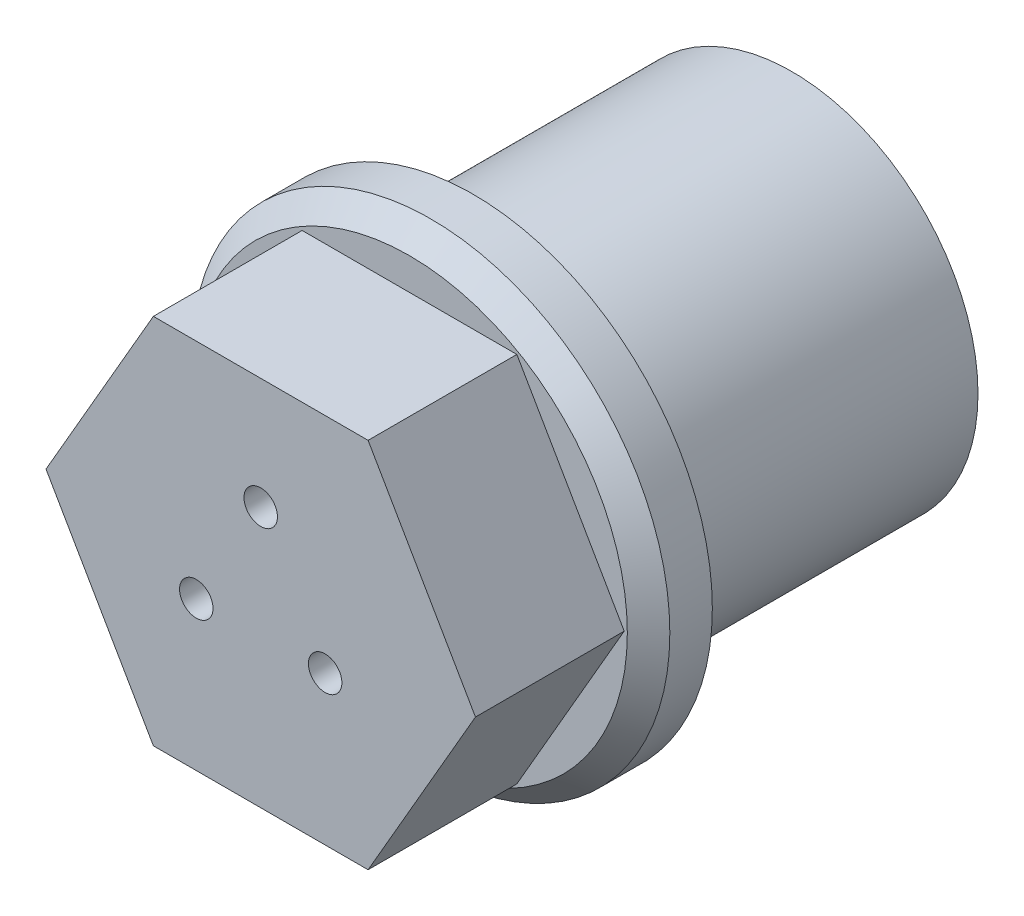
ISO-10303-21;
HEADER;
FILE_DESCRIPTION(('STEP AP214'),'2;1');
FILE_NAME('part.step','',(''),(''),'','','');
FILE_SCHEMA(('AUTOMOTIVE_DESIGN { 1 0 10303 214 1 1 1 1 }'));
ENDSEC;
DATA;
#1=APPLICATION_CONTEXT('core data for automotive mechanical design processes');
#2=APPLICATION_PROTOCOL_DEFINITION('international standard','automotive_design',2000,#1);
#3=PRODUCT_CONTEXT('',#1,'mechanical');
#4=PRODUCT('Part','Part','',(#3));
#5=PRODUCT_RELATED_PRODUCT_CATEGORY('part','',(#4));
#6=PRODUCT_DEFINITION_FORMATION('','',#4);
#7=PRODUCT_DEFINITION_CONTEXT('part definition',#1,'design');
#8=PRODUCT_DEFINITION('design','',#6,#7);
#9=PRODUCT_DEFINITION_SHAPE('','',#8);
#10=(LENGTH_UNIT() NAMED_UNIT(*) SI_UNIT(.MILLI.,.METRE.));
#11=(NAMED_UNIT(*) PLANE_ANGLE_UNIT() SI_UNIT($,.RADIAN.));
#12=(NAMED_UNIT(*) SI_UNIT($,.STERADIAN.) SOLID_ANGLE_UNIT());
#13=UNCERTAINTY_MEASURE_WITH_UNIT(LENGTH_MEASURE(1.E-05),#10,'distance_accuracy_value','');
#14=(GEOMETRIC_REPRESENTATION_CONTEXT(3) GLOBAL_UNCERTAINTY_ASSIGNED_CONTEXT((#13)) GLOBAL_UNIT_ASSIGNED_CONTEXT((#10,
#11,#12)) REPRESENTATION_CONTEXT('',''));
#15=CARTESIAN_POINT('',(0.,0.,0.));
#16=DIRECTION('',(0.,0.,1.));
#17=DIRECTION('',(1.,0.,0.));
#18=AXIS2_PLACEMENT_3D('',#15,#16,#17);
#19=CARTESIAN_POINT('',(0.,0.,31.75));
#20=DIRECTION('',(0.,0.,-1.));
#21=DIRECTION('',(-1.,0.,0.));
#22=AXIS2_PLACEMENT_3D('',#19,#20,#21);
#23=CYLINDRICAL_SURFACE('',#22,14.2875);
#24=CARTESIAN_POINT('',(0.,0.,21.59));
#25=DIRECTION('',(0.,0.,1.));
#26=DIRECTION('',(1.,0.,0.));
#27=AXIS2_PLACEMENT_3D('',#24,#25,#26);
#28=CIRCLE('',#27,14.2875);
#29=CARTESIAN_POINT('',(14.2875,0.,21.59));
#30=VERTEX_POINT('',#29);
#31=EDGE_CURVE('E12',#30,#30,#28,.F.);
#32=ORIENTED_EDGE('',*,*,#31,.T.);
#33=EDGE_LOOP('',(#32));
#34=FACE_BOUND('',#33,.T.);
#35=CARTESIAN_POINT('',(0.,0.,19.05));
#36=DIRECTION('',(0.,0.,1.));
#37=DIRECTION('',(1.,0.,0.));
#38=AXIS2_PLACEMENT_3D('',#35,#36,#37);
#39=CIRCLE('',#38,14.2875);
#40=CARTESIAN_POINT('',(14.2875,0.,19.05));
#41=VERTEX_POINT('',#40);
#42=EDGE_CURVE('E242',#41,#41,#39,.T.);
#43=ORIENTED_EDGE('',*,*,#42,.T.);
#44=EDGE_LOOP('',(#43));
#45=FACE_BOUND('',#44,.T.);
#46=ADVANCED_FACE('F40',(#34,#45),#23,.T.);
#47=CARTESIAN_POINT('',(0.,0.,19.05));
#48=DIRECTION('',(0.,0.,-1.));
#49=DIRECTION('',(-1.,0.,0.));
#50=AXIS2_PLACEMENT_3D('',#47,#48,#49);
#51=CYLINDRICAL_SURFACE('',#50,11.1125);
#52=CARTESIAN_POINT('',(0.,0.,19.05));
#53=DIRECTION('',(0.,0.,1.));
#54=DIRECTION('',(1.,0.,0.));
#55=AXIS2_PLACEMENT_3D('',#52,#53,#54);
#56=CIRCLE('',#55,11.1125);
#57=CARTESIAN_POINT('',(-11.1125,0.,19.05));
#58=VERTEX_POINT('',#57);
#59=EDGE_CURVE('E263',#58,#58,#56,.T.);
#60=CARTESIAN_POINT('',(0.,0.,0.));
#61=DIRECTION('',(0.,0.,1.));
#62=DIRECTION('',(1.,0.,0.));
#63=AXIS2_PLACEMENT_3D('',#60,#61,#62);
#64=CIRCLE('',#63,11.1125);
#65=CARTESIAN_POINT('',(-11.1125,0.,0.));
#66=VERTEX_POINT('',#65);
#67=EDGE_CURVE('E262',#66,#66,#64,.T.);
#68=CARTESIAN_POINT('',(-11.1125,0.,19.05));
#69=CARTESIAN_POINT('',(-11.1125,0.,18.8515625));
#70=CARTESIAN_POINT('',(-11.1125,0.,18.653125));
#71=CARTESIAN_POINT('',(-11.1125,0.,18.25625));
#72=CARTESIAN_POINT('',(-11.1125,0.,18.0578125));
#73=CARTESIAN_POINT('',(-11.1125,0.,17.6609375));
#74=CARTESIAN_POINT('',(-11.1125,0.,17.4625));
#75=CARTESIAN_POINT('',(-11.1125,0.,17.065625));
#76=CARTESIAN_POINT('',(-11.1125,0.,16.8671875));
#77=CARTESIAN_POINT('',(-11.1125,0.,16.4703125));
#78=CARTESIAN_POINT('',(-11.1125,0.,16.271875));
#79=CARTESIAN_POINT('',(-11.1125,0.,15.875));
#80=CARTESIAN_POINT('',(-11.1125,0.,15.6765625));
#81=CARTESIAN_POINT('',(-11.1125,0.,15.2796875));
#82=CARTESIAN_POINT('',(-11.1125,0.,15.08125));
#83=CARTESIAN_POINT('',(-11.1125,0.,14.684375));
#84=CARTESIAN_POINT('',(-11.1125,0.,14.4859375));
#85=CARTESIAN_POINT('',(-11.1125,0.,14.0890625));
#86=CARTESIAN_POINT('',(-11.1125,0.,13.890625));
#87=CARTESIAN_POINT('',(-11.1125,0.,13.49375));
#88=CARTESIAN_POINT('',(-11.1125,0.,13.2953125));
#89=CARTESIAN_POINT('',(-11.1125,0.,12.8984375));
#90=CARTESIAN_POINT('',(-11.1125,0.,12.7));
#91=CARTESIAN_POINT('',(-11.1125,0.,12.303125));
#92=CARTESIAN_POINT('',(-11.1125,0.,12.1046875));
#93=CARTESIAN_POINT('',(-11.1125,0.,11.7078125));
#94=CARTESIAN_POINT('',(-11.1125,0.,11.509375));
#95=CARTESIAN_POINT('',(-11.1125,0.,11.1125));
#96=CARTESIAN_POINT('',(-11.1125,0.,10.9140625));
#97=CARTESIAN_POINT('',(-11.1125,0.,10.5171875));
#98=CARTESIAN_POINT('',(-11.1125,0.,10.31875));
#99=CARTESIAN_POINT('',(-11.1125,0.,9.921875));
#100=CARTESIAN_POINT('',(-11.1125,0.,9.7234375));
#101=CARTESIAN_POINT('',(-11.1125,0.,9.3265625));
#102=CARTESIAN_POINT('',(-11.1125,0.,9.128125));
#103=CARTESIAN_POINT('',(-11.1125,0.,8.73125));
#104=CARTESIAN_POINT('',(-11.1125,0.,8.5328125));
#105=CARTESIAN_POINT('',(-11.1125,0.,8.1359375));
#106=CARTESIAN_POINT('',(-11.1125,0.,7.9375));
#107=CARTESIAN_POINT('',(-11.1125,0.,7.540625));
#108=CARTESIAN_POINT('',(-11.1125,0.,7.3421875));
#109=CARTESIAN_POINT('',(-11.1125,0.,6.9453125));
#110=CARTESIAN_POINT('',(-11.1125,0.,6.746875));
#111=CARTESIAN_POINT('',(-11.1125,0.,6.35));
#112=CARTESIAN_POINT('',(-11.1125,0.,6.1515625));
#113=CARTESIAN_POINT('',(-11.1125,0.,5.7546875));
#114=CARTESIAN_POINT('',(-11.1125,0.,5.55625));
#115=CARTESIAN_POINT('',(-11.1125,0.,5.159375));
#116=CARTESIAN_POINT('',(-11.1125,0.,4.9609375));
#117=CARTESIAN_POINT('',(-11.1125,0.,4.5640625));
#118=CARTESIAN_POINT('',(-11.1125,0.,4.365625));
#119=CARTESIAN_POINT('',(-11.1125,0.,3.96875));
#120=CARTESIAN_POINT('',(-11.1125,0.,3.7703125));
#121=CARTESIAN_POINT('',(-11.1125,0.,3.3734375));
#122=CARTESIAN_POINT('',(-11.1125,0.,3.175));
#123=CARTESIAN_POINT('',(-11.1125,0.,2.778125));
#124=CARTESIAN_POINT('',(-11.1125,0.,2.5796875));
#125=CARTESIAN_POINT('',(-11.1125,0.,2.1828125));
#126=CARTESIAN_POINT('',(-11.1125,0.,1.984375));
#127=CARTESIAN_POINT('',(-11.1125,0.,1.5875));
#128=CARTESIAN_POINT('',(-11.1125,0.,1.3890625));
#129=CARTESIAN_POINT('',(-11.1125,0.,0.992187500000001));
#130=CARTESIAN_POINT('',(-11.1125,0.,0.793750000000001));
#131=CARTESIAN_POINT('',(-11.1125,0.,0.396875));
#132=CARTESIAN_POINT('',(-11.1125,0.,0.1984375));
#133=CARTESIAN_POINT('',(-11.1125,0.,0.));
#134=B_SPLINE_CURVE_WITH_KNOTS('',3,(#68,#69,#70,#71,#72,#73,#74,#75,#76,#77,#78,#79,#80,#81,
#82,#83,#84,#85,#86,#87,#88,#89,#90,#91,#92,#93,#94,#95,#96,#97,#98,#99,#100,#101,#102,#103,
#104,#105,#106,#107,#108,#109,#110,#111,#112,#113,#114,#115,#116,#117,#118,#119,#120,#121,#122,
#123,#124,#125,#126,#127,#128,#129,#130,#131,#132,#133),.UNSPECIFIED.,.F.,.F.,(4,2,2,2,2,2,2,2,
2,2,2,2,2,2,2,2,2,2,2,2,2,2,2,2,2,2,2,2,2,2,2,2,4),(0.,0.5953125,1.190625,1.7859375,2.38125,
2.9765625,3.571875,4.1671875,4.7625,5.3578125,5.953125,6.5484375,7.14375,7.7390625,8.334375,
8.9296875,9.525,10.1203125,10.715625,11.3109375,11.90625,12.5015625,13.096875,13.6921875,
14.2875,14.8828125,15.478125,16.0734375,16.66875,17.2640625,17.859375,18.4546875,19.05),.UNSPECIFIED.);
#135=EDGE_CURVE('BSEAM285',#58,#66,#134,.T.);
#136=ORIENTED_EDGE('',*,*,#59,.F.);
#137=ORIENTED_EDGE('',*,*,#67,.T.);
#138=ORIENTED_EDGE('',*,*,#135,.T.);
#139=ORIENTED_EDGE('',*,*,#135,.F.);
#140=EDGE_LOOP('',(#136,#138,#137,#139));
#141=FACE_BOUND('',#140,.T.);
#142=ADVANCED_FACE('F285',(#141),#51,.T.);
#143=CARTESIAN_POINT('',(0.,0.,0.));
#144=DIRECTION('',(0.,0.,1.));
#145=DIRECTION('',(1.,0.,0.));
#146=AXIS2_PLACEMENT_3D('',#143,#144,#145);
#147=PLANE('',#146);
#148=CARTESIAN_POINT('',(0.,0.,0.));
#149=DIRECTION('',(0.,0.,-1.));
#150=DIRECTION('',(-1.,0.,0.));
#151=AXIS2_PLACEMENT_3D('',#148,#149,#150);
#152=CIRCLE('',#151,9.5504);
#153=CARTESIAN_POINT('',(-9.5504,0.,0.));
#154=VERTEX_POINT('',#153);
#155=EDGE_CURVE('E129',#154,#154,#152,.T.);
#156=ORIENTED_EDGE('',*,*,#155,.F.);
#157=EDGE_LOOP('',(#156));
#158=FACE_BOUND('',#157,.T.);
#159=ORIENTED_EDGE('',*,*,#67,.F.);
#160=EDGE_LOOP('',(#159));
#161=FACE_BOUND('',#160,.T.);
#162=ADVANCED_FACE('F291',(#158,#161),#147,.F.);
#163=CARTESIAN_POINT('',(0.,0.,19.05));
#164=DIRECTION('',(0.,0.,1.));
#165=DIRECTION('',(1.,0.,0.));
#166=AXIS2_PLACEMENT_3D('',#163,#164,#165);
#167=PLANE('',#166);
#168=ORIENTED_EDGE('',*,*,#59,.T.);
#169=EDGE_LOOP('',(#168));
#170=FACE_BOUND('',#169,.T.);
#171=ORIENTED_EDGE('',*,*,#42,.F.);
#172=EDGE_LOOP('',(#171));
#173=FACE_BOUND('',#172,.T.);
#174=ADVANCED_FACE('F296',(#170,#173),#167,.F.);
#175=CARTESIAN_POINT('',(0.,0.,22.86));
#176=DIRECTION('',(0.,0.,1.));
#177=DIRECTION('',(1.,0.,0.));
#178=AXIS2_PLACEMENT_3D('',#175,#176,#177);
#179=PLANE('',#178);
#180=CARTESIAN_POINT('',(0.,0.,22.86));
#181=DIRECTION('',(0.,0.,1.));
#182=DIRECTION('',(1.,0.,0.));
#183=AXIS2_PLACEMENT_3D('',#180,#181,#182);
#184=CIRCLE('',#183,13.0175);
#185=CARTESIAN_POINT('',(13.0175,0.,22.86));
#186=VERTEX_POINT('',#185);
#187=EDGE_CURVE('E52',#186,#186,#184,.T.);
#188=ORIENTED_EDGE('',*,*,#187,.T.);
#189=EDGE_LOOP('',(#188));
#190=FACE_BOUND('',#189,.T.);
#191=DIRECTION('',(1.,0.,0.));
#192=VECTOR('',#191,1.);
#193=CARTESIAN_POINT('',(-6.41580486636972,-11.1125,22.86));
#194=LINE('',#193,#192);
#195=CARTESIAN_POINT('',(-6.41580486636972,-11.1125,22.86));
#196=VERTEX_POINT('',#195);
#197=CARTESIAN_POINT('',(6.41580486636972,-11.1125,22.86));
#198=VERTEX_POINT('',#197);
#199=EDGE_CURVE('E222',#196,#198,#194,.T.);
#200=ORIENTED_EDGE('',*,*,#199,.F.);
#201=DIRECTION('',(0.5,-0.866025403784439,0.));
#202=VECTOR('',#201,1.);
#203=CARTESIAN_POINT('',(-12.8316097327394,0.,22.86));
#204=LINE('',#203,#202);
#205=CARTESIAN_POINT('',(-12.8316097327394,0.,22.86));
#206=VERTEX_POINT('',#205);
#207=EDGE_CURVE('E349',#206,#196,#204,.T.);
#208=ORIENTED_EDGE('',*,*,#207,.F.);
#209=DIRECTION('',(-0.5,-0.866025403784439,0.));
#210=VECTOR('',#209,1.);
#211=CARTESIAN_POINT('',(-6.41580486636972,11.1125,22.86));
#212=LINE('',#211,#210);
#213=CARTESIAN_POINT('',(-6.41580486636972,11.1125,22.86));
#214=VERTEX_POINT('',#213);
#215=EDGE_CURVE('E346',#214,#206,#212,.T.);
#216=ORIENTED_EDGE('',*,*,#215,.F.);
#217=DIRECTION('',(-1.,0.,0.));
#218=VECTOR('',#217,1.);
#219=CARTESIAN_POINT('',(6.41580486636971,11.1125,22.86));
#220=LINE('',#219,#218);
#221=CARTESIAN_POINT('',(6.41580486636971,11.1125,22.86));
#222=VERTEX_POINT('',#221);
#223=EDGE_CURVE('E350',#222,#214,#220,.T.);
#224=ORIENTED_EDGE('',*,*,#223,.F.);
#225=DIRECTION('',(-0.5,0.866025403784438,0.));
#226=VECTOR('',#225,1.);
#227=CARTESIAN_POINT('',(12.8316097327394,0.,22.86));
#228=LINE('',#227,#226);
#229=CARTESIAN_POINT('',(12.8316097327394,0.,22.86));
#230=VERTEX_POINT('',#229);
#231=EDGE_CURVE('E354',#230,#222,#228,.T.);
#232=ORIENTED_EDGE('',*,*,#231,.F.);
#233=DIRECTION('',(0.5,0.866025403784439,0.));
#234=VECTOR('',#233,1.);
#235=CARTESIAN_POINT('',(6.41580486636972,-11.1125,22.86));
#236=LINE('',#235,#234);
#237=EDGE_CURVE('E198',#198,#230,#236,.T.);
#238=ORIENTED_EDGE('',*,*,#237,.F.);
#239=EDGE_LOOP('',(#200,#208,#216,#224,#232,#238));
#240=FACE_BOUND('',#239,.T.);
#241=ADVANCED_FACE('F271',(#190,#240),#179,.T.);
#242=CARTESIAN_POINT('',(6.41580486636972,-11.1125,22.86));
#243=DIRECTION('',(0.866025403784439,-0.5,0.));
#244=DIRECTION('',(0.5,0.866025403784439,0.));
#245=AXIS2_PLACEMENT_3D('',#242,#243,#244);
#246=PLANE('',#245);
#247=DIRECTION('',(0.5,0.866025403784439,0.));
#248=VECTOR('',#247,1.);
#249=CARTESIAN_POINT('',(6.41580486636972,-11.1125,31.75));
#250=LINE('',#249,#248);
#251=CARTESIAN_POINT('',(6.41580486636972,-11.1125,31.75));
#252=VERTEX_POINT('',#251);
#253=CARTESIAN_POINT('',(12.8316097327394,0.,31.75));
#254=VERTEX_POINT('',#253);
#255=EDGE_CURVE('E207',#252,#254,#250,.T.);
#256=ORIENTED_EDGE('',*,*,#255,.F.);
#257=DIRECTION('',(0.,0.,1.));
#258=VECTOR('',#257,1.);
#259=CARTESIAN_POINT('',(6.41580486636972,-11.1125,22.86));
#260=LINE('',#259,#258);
#261=EDGE_CURVE('E239',#198,#252,#260,.T.);
#262=ORIENTED_EDGE('',*,*,#261,.F.);
#263=ORIENTED_EDGE('',*,*,#237,.T.);
#264=DIRECTION('',(0.,0.,1.));
#265=VECTOR('',#264,1.);
#266=CARTESIAN_POINT('',(12.8316097327394,0.,22.86));
#267=LINE('',#266,#265);
#268=EDGE_CURVE('E256',#230,#254,#267,.T.);
#269=ORIENTED_EDGE('',*,*,#268,.T.);
#270=EDGE_LOOP('',(#256,#262,#263,#269));
#271=FACE_BOUND('',#270,.T.);
#272=ADVANCED_FACE('F311',(#271),#246,.T.);
#273=CARTESIAN_POINT('',(-6.41580486636972,-11.1125,22.86));
#274=DIRECTION('',(0.,-1.,0.));
#275=DIRECTION('',(1.,0.,0.));
#276=AXIS2_PLACEMENT_3D('',#273,#274,#275);
#277=PLANE('',#276);
#278=DIRECTION('',(1.,0.,0.));
#279=VECTOR('',#278,1.);
#280=CARTESIAN_POINT('',(-6.41580486636972,-11.1125,31.75));
#281=LINE('',#280,#279);
#282=CARTESIAN_POINT('',(-6.41580486636972,-11.1125,31.75));
#283=VERTEX_POINT('',#282);
#284=EDGE_CURVE('E236',#283,#252,#281,.T.);
#285=ORIENTED_EDGE('',*,*,#284,.F.);
#286=DIRECTION('',(0.,0.,1.));
#287=VECTOR('',#286,1.);
#288=CARTESIAN_POINT('',(-6.41580486636972,-11.1125,22.86));
#289=LINE('',#288,#287);
#290=EDGE_CURVE('E243',#196,#283,#289,.T.);
#291=ORIENTED_EDGE('',*,*,#290,.F.);
#292=ORIENTED_EDGE('',*,*,#199,.T.);
#293=ORIENTED_EDGE('',*,*,#261,.T.);
#294=EDGE_LOOP('',(#285,#291,#292,#293));
#295=FACE_BOUND('',#294,.T.);
#296=ADVANCED_FACE('F184',(#295),#277,.T.);
#297=CARTESIAN_POINT('',(-12.8316097327394,0.,22.86));
#298=DIRECTION('',(-0.866025403784439,-0.5,0.));
#299=DIRECTION('',(0.5,-0.866025403784439,0.));
#300=AXIS2_PLACEMENT_3D('',#297,#298,#299);
#301=PLANE('',#300);
#302=DIRECTION('',(0.5,-0.866025403784439,0.));
#303=VECTOR('',#302,1.);
#304=CARTESIAN_POINT('',(-12.8316097327394,0.,31.75));
#305=LINE('',#304,#303);
#306=CARTESIAN_POINT('',(-12.8316097327394,0.,31.75));
#307=VERTEX_POINT('',#306);
#308=EDGE_CURVE('E232',#307,#283,#305,.T.);
#309=ORIENTED_EDGE('',*,*,#308,.F.);
#310=DIRECTION('',(0.,0.,1.));
#311=VECTOR('',#310,1.);
#312=CARTESIAN_POINT('',(-12.8316097327394,0.,22.86));
#313=LINE('',#312,#311);
#314=EDGE_CURVE('E246',#206,#307,#313,.T.);
#315=ORIENTED_EDGE('',*,*,#314,.F.);
#316=ORIENTED_EDGE('',*,*,#207,.T.);
#317=ORIENTED_EDGE('',*,*,#290,.T.);
#318=EDGE_LOOP('',(#309,#315,#316,#317));
#319=FACE_BOUND('',#318,.T.);
#320=ADVANCED_FACE('F331',(#319),#301,.T.);
#321=CARTESIAN_POINT('',(-6.41580486636972,11.1125,22.86));
#322=DIRECTION('',(-0.866025403784439,0.5,0.));
#323=DIRECTION('',(-0.5,-0.866025403784439,0.));
#324=AXIS2_PLACEMENT_3D('',#321,#322,#323);
#325=PLANE('',#324);
#326=DIRECTION('',(-0.5,-0.866025403784439,0.));
#327=VECTOR('',#326,1.);
#328=CARTESIAN_POINT('',(-6.41580486636972,11.1125,31.75));
#329=LINE('',#328,#327);
#330=CARTESIAN_POINT('',(-6.41580486636972,11.1125,31.75));
#331=VERTEX_POINT('',#330);
#332=EDGE_CURVE('E228',#331,#307,#329,.T.);
#333=ORIENTED_EDGE('',*,*,#332,.F.);
#334=DIRECTION('',(0.,0.,1.));
#335=VECTOR('',#334,1.);
#336=CARTESIAN_POINT('',(-6.41580486636972,11.1125,22.86));
#337=LINE('',#336,#335);
#338=EDGE_CURVE('E249',#214,#331,#337,.T.);
#339=ORIENTED_EDGE('',*,*,#338,.F.);
#340=ORIENTED_EDGE('',*,*,#215,.T.);
#341=ORIENTED_EDGE('',*,*,#314,.T.);
#342=EDGE_LOOP('',(#333,#339,#340,#341));
#343=FACE_BOUND('',#342,.T.);
#344=ADVANCED_FACE('F328',(#343),#325,.T.);
#345=CARTESIAN_POINT('',(6.41580486636971,11.1125,22.86));
#346=DIRECTION('',(0.,1.,0.));
#347=DIRECTION('',(0.,0.,1.));
#348=AXIS2_PLACEMENT_3D('',#345,#346,#347);
#349=PLANE('',#348);
#350=DIRECTION('',(-1.,0.,0.));
#351=VECTOR('',#350,1.);
#352=CARTESIAN_POINT('',(6.41580486636971,11.1125,31.75));
#353=LINE('',#352,#351);
#354=CARTESIAN_POINT('',(6.41580486636971,11.1125,31.75));
#355=VERTEX_POINT('',#354);
#356=EDGE_CURVE('E219',#355,#331,#353,.T.);
#357=ORIENTED_EDGE('',*,*,#356,.F.);
#358=DIRECTION('',(0.,0.,1.));
#359=VECTOR('',#358,1.);
#360=CARTESIAN_POINT('',(6.41580486636971,11.1125,22.86));
#361=LINE('',#360,#359);
#362=EDGE_CURVE('E252',#222,#355,#361,.T.);
#363=ORIENTED_EDGE('',*,*,#362,.F.);
#364=ORIENTED_EDGE('',*,*,#223,.T.);
#365=ORIENTED_EDGE('',*,*,#338,.T.);
#366=EDGE_LOOP('',(#357,#363,#364,#365));
#367=FACE_BOUND('',#366,.T.);
#368=ADVANCED_FACE('F324',(#367),#349,.T.);
#369=CARTESIAN_POINT('',(12.8316097327394,0.,22.86));
#370=DIRECTION('',(0.866025403784438,0.5,0.));
#371=DIRECTION('',(-0.5,0.866025403784439,0.));
#372=AXIS2_PLACEMENT_3D('',#369,#370,#371);
#373=PLANE('',#372);
#374=DIRECTION('',(-0.5,0.866025403784438,0.));
#375=VECTOR('',#374,1.);
#376=CARTESIAN_POINT('',(12.8316097327394,0.,31.75));
#377=LINE('',#376,#375);
#378=EDGE_CURVE('E211',#254,#355,#377,.T.);
#379=ORIENTED_EDGE('',*,*,#378,.F.);
#380=ORIENTED_EDGE('',*,*,#268,.F.);
#381=ORIENTED_EDGE('',*,*,#231,.T.);
#382=ORIENTED_EDGE('',*,*,#362,.T.);
#383=EDGE_LOOP('',(#379,#380,#381,#382));
#384=FACE_BOUND('',#383,.T.);
#385=ADVANCED_FACE('F280',(#384),#373,.T.);
#386=CARTESIAN_POINT('',(0.,0.,31.75));
#387=DIRECTION('',(0.,0.,1.));
#388=DIRECTION('',(1.,0.,0.));
#389=AXIS2_PLACEMENT_3D('',#386,#387,#388);
#390=PLANE('',#389);
#391=CARTESIAN_POINT('',(0.,4.445,31.75));
#392=DIRECTION('',(0.,0.,1.));
#393=DIRECTION('',(1.,0.,0.));
#394=AXIS2_PLACEMENT_3D('',#391,#392,#393);
#395=CIRCLE('',#394,1.);
#396=CARTESIAN_POINT('',(1.,4.445,31.75));
#397=VERTEX_POINT('',#396);
#398=EDGE_CURVE('E130',#397,#397,#395,.T.);
#399=ORIENTED_EDGE('',*,*,#398,.F.);
#400=EDGE_LOOP('',(#399));
#401=FACE_BOUND('',#400,.T.);
#402=CARTESIAN_POINT('',(3.84948291982211,-2.22249999999983,31.75));
#403=DIRECTION('',(0.,0.,1.));
#404=DIRECTION('',(1.,0.,0.));
#405=AXIS2_PLACEMENT_3D('',#402,#403,#404);
#406=CIRCLE('',#405,1.00000000000024);
#407=CARTESIAN_POINT('',(4.84948291982236,-2.22249999999983,31.75));
#408=VERTEX_POINT('',#407);
#409=EDGE_CURVE('E368',#408,#408,#406,.T.);
#410=ORIENTED_EDGE('',*,*,#409,.F.);
#411=EDGE_LOOP('',(#410));
#412=FACE_BOUND('',#411,.T.);
#413=CARTESIAN_POINT('',(-3.84948291982154,-2.22250000000017,31.75));
#414=DIRECTION('',(0.,0.,1.));
#415=DIRECTION('',(1.,0.,0.));
#416=AXIS2_PLACEMENT_3D('',#413,#414,#415);
#417=CIRCLE('',#416,1.00000000000036);
#418=CARTESIAN_POINT('',(-2.84948291982119,-2.22250000000017,31.75));
#419=VERTEX_POINT('',#418);
#420=EDGE_CURVE('E373',#419,#419,#417,.T.);
#421=ORIENTED_EDGE('',*,*,#420,.F.);
#422=EDGE_LOOP('',(#421));
#423=FACE_BOUND('',#422,.T.);
#424=ORIENTED_EDGE('',*,*,#284,.T.);
#425=ORIENTED_EDGE('',*,*,#255,.T.);
#426=ORIENTED_EDGE('',*,*,#378,.T.);
#427=ORIENTED_EDGE('',*,*,#356,.T.);
#428=ORIENTED_EDGE('',*,*,#332,.T.);
#429=ORIENTED_EDGE('',*,*,#308,.T.);
#430=EDGE_LOOP('',(#424,#425,#426,#427,#428,#429));
#431=FACE_BOUND('',#430,.T.);
#432=ADVANCED_FACE('F275',(#401,#412,#423,#431),#390,.T.);
#433=CARTESIAN_POINT('',(0.,0.,22.86));
#434=DIRECTION('',(0.,0.,-1.));
#435=DIRECTION('',(-1.,0.,0.));
#436=AXIS2_PLACEMENT_3D('',#433,#434,#435);
#437=CONICAL_SURFACE('',#436,13.0175,0.785398163397442);
#438=ORIENTED_EDGE('',*,*,#31,.F.);
#439=EDGE_LOOP('',(#438));
#440=FACE_BOUND('',#439,.T.);
#441=ORIENTED_EDGE('',*,*,#187,.F.);
#442=EDGE_LOOP('',(#441));
#443=FACE_BOUND('',#442,.T.);
#444=ADVANCED_FACE('F42',(#440,#443),#437,.T.);
#445=CARTESIAN_POINT('',(0.,0.,22.86));
#446=DIRECTION('',(0.,0.,1.));
#447=DIRECTION('',(1.,0.,0.));
#448=AXIS2_PLACEMENT_3D('',#445,#446,#447);
#449=PLANE('',#448);
#450=CARTESIAN_POINT('',(0.,4.445,22.86));
#451=DIRECTION('',(0.,0.,1.));
#452=DIRECTION('',(1.,0.,0.));
#453=AXIS2_PLACEMENT_3D('',#450,#451,#452);
#454=CIRCLE('',#453,1.);
#455=CARTESIAN_POINT('',(0.000123497343628788,5.44499999236823,22.86));
#456=VERTEX_POINT('',#455);
#457=CARTESIAN_POINT('',(0.,5.445,22.86));
#458=VERTEX_POINT('',#457);
#459=EDGE_CURVE('E122',#456,#458,#454,.F.);
#460=ORIENTED_EDGE('',*,*,#459,.F.);
#461=CARTESIAN_POINT('',(0.,0.,22.86));
#462=DIRECTION('',(0.,0.,1.));
#463=DIRECTION('',(1.,0.,0.));
#464=AXIS2_PLACEMENT_3D('',#461,#462,#463);
#465=CIRCLE('',#464,5.445);
#466=CARTESIAN_POINT('',(4.71552357610018,-2.72247266870399,22.86));
#467=VERTEX_POINT('',#466);
#468=EDGE_CURVE('E143',#467,#456,#465,.T.);
#469=ORIENTED_EDGE('',*,*,#468,.F.);
#470=CARTESIAN_POINT('',(3.84948291982211,-2.22249999999983,22.86));
#471=DIRECTION('',(0.,0.,1.));
#472=DIRECTION('',(1.,0.,0.));
#473=AXIS2_PLACEMENT_3D('',#470,#471,#472);
#474=CIRCLE('',#473,1.00000000000024);
#475=EDGE_CURVE('E71',#467,#467,#474,.F.);
#476=ORIENTED_EDGE('',*,*,#475,.F.);
#477=CARTESIAN_POINT('',(-4.71550300743985,-2.72251631265119,22.86));
#478=VERTEX_POINT('',#477);
#479=EDGE_CURVE('E202',#478,#467,#465,.T.);
#480=ORIENTED_EDGE('',*,*,#479,.F.);
#481=CARTESIAN_POINT('',(-3.84948291982154,-2.22250000000017,22.86));
#482=DIRECTION('',(0.,0.,1.));
#483=DIRECTION('',(1.,0.,0.));
#484=AXIS2_PLACEMENT_3D('',#481,#482,#483);
#485=CIRCLE('',#484,1.00000000000036);
#486=EDGE_CURVE('E138',#478,#478,#485,.F.);
#487=ORIENTED_EDGE('',*,*,#486,.F.);
#488=EDGE_CURVE('E134',#458,#478,#465,.T.);
#489=ORIENTED_EDGE('',*,*,#488,.F.);
#490=EDGE_LOOP('',(#460,#469,#476,#480,#487,#489));
#491=FACE_BOUND('',#490,.T.);
#492=ADVANCED_FACE('F136',(#491),#449,.F.);
#493=CARTESIAN_POINT('',(2.35183173975593,9.25629664757329,0.));
#494=CARTESIAN_POINT('',(2.64410942475608,4.75990654844358,22.86));
#495=CARTESIAN_POINT('',(-16.1607615553907,13.9599601270852,0.));
#496=CARTESIAN_POINT('',(-6.87570367213108,10.0481253979557,22.86));
#497=CARTESIAN_POINT('',(-20.8644250349025,-4.55263316806144,0.));
#498=CARTESIAN_POINT('',(-12.1639225216432,0.528312301068575,22.86));
#499=CARTESIAN_POINT('',(-2.35183173975593,-9.25629664757329,0.));
#500=CARTESIAN_POINT('',(-2.64410942475608,-4.75990654844358,22.86));
#501=CARTESIAN_POINT('',(16.1607615553906,-13.9599601270851,0.));
#502=CARTESIAN_POINT('',(6.87570367213108,-10.0481253979557,22.86));
#503=CARTESIAN_POINT('',(20.8644250349025,4.55263316806143,0.));
#504=CARTESIAN_POINT('',(12.1639225216432,-0.528312301068574,22.86));
#505=CARTESIAN_POINT('',(2.35183173975593,9.25629664757329,0.));
#506=CARTESIAN_POINT('',(2.64410942475608,4.75990654844358,22.86));
#507=(BOUNDED_SURFACE() B_SPLINE_SURFACE(3,1,((#493,#494),(#495,#496),(#497,#498),(#499,#500),
(#501,#502),(#503,#504),(#505,#506)),.UNSPECIFIED.,.T.,.F.,.F.) B_SPLINE_SURFACE_WITH_KNOTS((4,
3,4),(2,2),(0.,0.5,1.),(0.,1.),
.UNSPECIFIED.) GEOMETRIC_REPRESENTATION_ITEM() RATIONAL_B_SPLINE_SURFACE(((1.,1.),
(0.333333333333333,0.333333333333333),(0.333333333333333,0.333333333333333),(1.,1.),
(0.333333333333334,0.333333333333333),(0.333333333333334,0.333333333333333),(1.,1.))) REPRESENTATION_ITEM('') SURFACE());
#508=CARTESIAN_POINT('',(2.64410942475608,4.7599065484436,22.8599999999999));
#509=CARTESIAN_POINT('',(-6.87570367213111,10.0481253979557,22.8599999999999));
#510=CARTESIAN_POINT('',(-12.1639225216433,0.528312301068558,22.8599999999999));
#511=CARTESIAN_POINT('',(-2.64410942475608,-4.7599065484436,22.8599999999999));
#512=CARTESIAN_POINT('',(6.87570367213111,-10.0481253979557,22.8599999999999));
#513=CARTESIAN_POINT('',(12.1639225216433,-0.528312301068557,22.8599999999999));
#514=CARTESIAN_POINT('',(2.64410942475608,4.7599065484436,22.8599999999999));
#515=(BOUNDED_CURVE() B_SPLINE_CURVE(3,(#508,#509,#510,#511,#512,#513,#514),.UNSPECIFIED.,.T.,
.F.) B_SPLINE_CURVE_WITH_KNOTS((4,3,4),(0.,0.5,1.),
.UNSPECIFIED.) CURVE() GEOMETRIC_REPRESENTATION_ITEM() RATIONAL_B_SPLINE_CURVE((1.,
0.333333333333333,0.333333333333333,1.,0.333333333333333,0.333333333333333,1.)) REPRESENTATION_ITEM(''));
#516=EDGE_CURVE('E62',#456,#458,#515,.T.);
#517=ORIENTED_EDGE('',*,*,#155,.T.);
#518=EDGE_LOOP('',(#517));
#519=FACE_BOUND('',#518,.T.);
#520=ORIENTED_EDGE('',*,*,#479,.T.);
#521=ORIENTED_EDGE('',*,*,#468,.T.);
#522=ORIENTED_EDGE('',*,*,#516,.T.);
#523=ORIENTED_EDGE('',*,*,#488,.T.);
#524=EDGE_LOOP('',(#520,#521,#522,#523));
#525=FACE_BOUND('',#524,.T.);
#526=ADVANCED_FACE('F148',(#519,#525),#507,.F.);
#527=CARTESIAN_POINT('',(-3.84948291982154,-2.22250000000017,-0.00101999999999741));
#528=DIRECTION('',(0.,0.,1.));
#529=DIRECTION('',(1.,0.,0.));
#530=AXIS2_PLACEMENT_3D('',#527,#528,#529);
#531=CYLINDRICAL_SURFACE('',#530,1.00000000000036);
#532=ORIENTED_EDGE('',*,*,#420,.T.);
#533=EDGE_LOOP('',(#532));
#534=FACE_BOUND('',#533,.T.);
#535=ORIENTED_EDGE('',*,*,#486,.T.);
#536=EDGE_LOOP('',(#535));
#537=FACE_BOUND('',#536,.T.);
#538=ADVANCED_FACE('F173',(#534,#537),#531,.F.);
#539=CARTESIAN_POINT('',(3.84948291982211,-2.22249999999983,-0.00101999999999741));
#540=DIRECTION('',(0.,0.,1.));
#541=DIRECTION('',(1.,0.,0.));
#542=AXIS2_PLACEMENT_3D('',#539,#540,#541);
#543=CYLINDRICAL_SURFACE('',#542,1.00000000000024);
#544=ORIENTED_EDGE('',*,*,#409,.T.);
#545=EDGE_LOOP('',(#544));
#546=FACE_BOUND('',#545,.T.);
#547=ORIENTED_EDGE('',*,*,#475,.T.);
#548=EDGE_LOOP('',(#547));
#549=FACE_BOUND('',#548,.T.);
#550=ADVANCED_FACE('F395',(#546,#549),#543,.F.);
#551=CARTESIAN_POINT('',(0.,4.445,-0.00101999999999741));
#552=DIRECTION('',(0.,0.,1.));
#553=DIRECTION('',(1.,0.,0.));
#554=AXIS2_PLACEMENT_3D('',#551,#552,#553);
#555=CYLINDRICAL_SURFACE('',#554,1.);
#556=ORIENTED_EDGE('',*,*,#398,.T.);
#557=EDGE_LOOP('',(#556));
#558=FACE_BOUND('',#557,.T.);
#559=ORIENTED_EDGE('',*,*,#516,.F.);
#560=ORIENTED_EDGE('',*,*,#459,.T.);
#561=EDGE_LOOP('',(#559,#560));
#562=FACE_BOUND('',#561,.T.);
#563=ADVANCED_FACE('F124',(#558,#562),#555,.F.);
#564=CLOSED_SHELL('',(#46,#142,#162,#174,#241,#272,#296,#320,#344,#368,#385,#432,#444,#492,#526,
#538,#550,#563));
#565=MANIFOLD_SOLID_BREP('B2',#564);
#566=ADVANCED_BREP_SHAPE_REPRESENTATION('',(#18,#565),#14);
#567=SHAPE_DEFINITION_REPRESENTATION(#9,#566);
ENDSEC;
END-ISO-10303-21;
